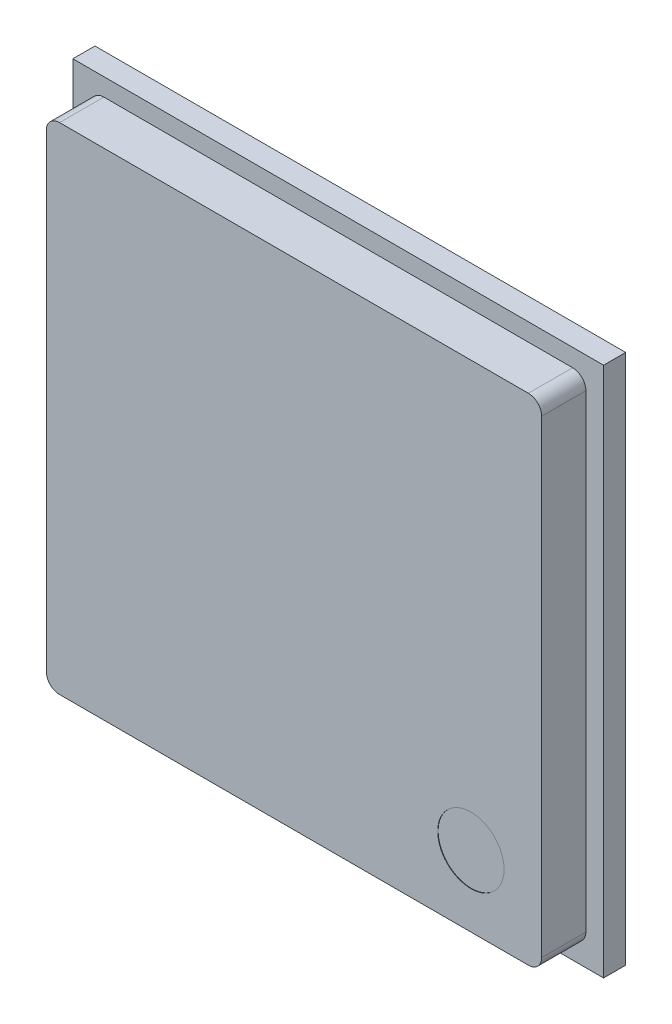
ISO-10303-21;
HEADER;
FILE_DESCRIPTION(('STEP AP214'),'2;1');
FILE_NAME('part.step','',(''),(''),'','','');
FILE_SCHEMA(('AUTOMOTIVE_DESIGN { 1 0 10303 214 1 1 1 1 }'));
ENDSEC;
DATA;
#1=APPLICATION_CONTEXT('core data for automotive mechanical design processes');
#2=APPLICATION_PROTOCOL_DEFINITION('international standard','automotive_design',2000,#1);
#3=PRODUCT_CONTEXT('',#1,'mechanical');
#4=PRODUCT('Part','Part','',(#3));
#5=PRODUCT_RELATED_PRODUCT_CATEGORY('part','',(#4));
#6=PRODUCT_DEFINITION_FORMATION('','',#4);
#7=PRODUCT_DEFINITION_CONTEXT('part definition',#1,'design');
#8=PRODUCT_DEFINITION('design','',#6,#7);
#9=PRODUCT_DEFINITION_SHAPE('','',#8);
#10=(LENGTH_UNIT() NAMED_UNIT(*) SI_UNIT(.MILLI.,.METRE.));
#11=(NAMED_UNIT(*) PLANE_ANGLE_UNIT() SI_UNIT($,.RADIAN.));
#12=(NAMED_UNIT(*) SI_UNIT($,.STERADIAN.) SOLID_ANGLE_UNIT());
#13=UNCERTAINTY_MEASURE_WITH_UNIT(LENGTH_MEASURE(1.E-05),#10,'distance_accuracy_value','');
#14=(GEOMETRIC_REPRESENTATION_CONTEXT(3) GLOBAL_UNCERTAINTY_ASSIGNED_CONTEXT((#13)) GLOBAL_UNIT_ASSIGNED_CONTEXT((#10,
#11,#12)) REPRESENTATION_CONTEXT('',''));
#15=CARTESIAN_POINT('',(0.,0.,0.));
#16=DIRECTION('',(0.,0.,1.));
#17=DIRECTION('',(1.,0.,0.));
#18=AXIS2_PLACEMENT_3D('',#15,#16,#17);
#19=CARTESIAN_POINT('',(0.,0.,0.5));
#20=DIRECTION('',(0.,0.,1.));
#21=DIRECTION('',(1.,0.,0.));
#22=AXIS2_PLACEMENT_3D('',#19,#20,#21);
#23=PLANE('',#22);
#24=DIRECTION('',(0.,-1.,0.));
#25=VECTOR('',#24,1.);
#26=CARTESIAN_POINT('',(0.,0.,0.5));
#27=LINE('',#26,#25);
#28=CARTESIAN_POINT('',(0.,0.,0.5));
#29=VERTEX_POINT('',#28);
#30=CARTESIAN_POINT('',(0.,-12.,0.5));
#31=VERTEX_POINT('',#30);
#32=EDGE_CURVE('E132',#29,#31,#27,.T.);
#33=ORIENTED_EDGE('',*,*,#32,.T.);
#34=DIRECTION('',(1.,0.,0.));
#35=VECTOR('',#34,1.);
#36=CARTESIAN_POINT('',(0.,-12.,0.5));
#37=LINE('',#36,#35);
#38=CARTESIAN_POINT('',(12.,-12.,0.5));
#39=VERTEX_POINT('',#38);
#40=EDGE_CURVE('E121',#31,#39,#37,.T.);
#41=ORIENTED_EDGE('',*,*,#40,.T.);
#42=DIRECTION('',(0.,1.,0.));
#43=VECTOR('',#42,1.);
#44=CARTESIAN_POINT('',(12.,0.,0.5));
#45=LINE('',#44,#43);
#46=CARTESIAN_POINT('',(12.,0.,0.5));
#47=VERTEX_POINT('',#46);
#48=EDGE_CURVE('E131',#39,#47,#45,.T.);
#49=ORIENTED_EDGE('',*,*,#48,.T.);
#50=DIRECTION('',(-1.,0.,0.));
#51=VECTOR('',#50,1.);
#52=CARTESIAN_POINT('',(0.,0.,0.5));
#53=LINE('',#52,#51);
#54=EDGE_CURVE('E136',#47,#29,#53,.T.);
#55=ORIENTED_EDGE('',*,*,#54,.T.);
#56=EDGE_LOOP('',(#33,#41,#49,#55));
#57=FACE_BOUND('',#56,.T.);
#58=DIRECTION('',(1.,0.,0.));
#59=VECTOR('',#58,1.);
#60=CARTESIAN_POINT('',(0.400000000000001,-11.6,0.5));
#61=LINE('',#60,#59);
#62=CARTESIAN_POINT('',(0.700000000000001,-11.6,0.5));
#63=VERTEX_POINT('',#62);
#64=CARTESIAN_POINT('',(11.3,-11.6,0.5));
#65=VERTEX_POINT('',#64);
#66=EDGE_CURVE('E193',#63,#65,#61,.T.);
#67=ORIENTED_EDGE('',*,*,#66,.F.);
#68=CARTESIAN_POINT('',(0.700000000000001,-11.3,0.5));
#69=DIRECTION('',(0.,0.,1.));
#70=DIRECTION('',(1.,0.,0.));
#71=AXIS2_PLACEMENT_3D('',#68,#69,#70);
#72=CIRCLE('',#71,0.3);
#73=CARTESIAN_POINT('',(0.400000000000001,-11.3,0.5));
#74=VERTEX_POINT('',#73);
#75=EDGE_CURVE('E11',#63,#74,#72,.F.);
#76=ORIENTED_EDGE('',*,*,#75,.T.);
#77=DIRECTION('',(0.,-1.,0.));
#78=VECTOR('',#77,1.);
#79=CARTESIAN_POINT('',(0.4,-0.4,0.5));
#80=LINE('',#79,#78);
#81=CARTESIAN_POINT('',(0.4,-0.7,0.5));
#82=VERTEX_POINT('',#81);
#83=EDGE_CURVE('E214',#82,#74,#80,.T.);
#84=ORIENTED_EDGE('',*,*,#83,.F.);
#85=CARTESIAN_POINT('',(0.7,-0.7,0.5));
#86=DIRECTION('',(0.,0.,1.));
#87=DIRECTION('',(1.,0.,0.));
#88=AXIS2_PLACEMENT_3D('',#85,#86,#87);
#89=CIRCLE('',#88,0.3);
#90=CARTESIAN_POINT('',(0.7,-0.4,0.5));
#91=VERTEX_POINT('',#90);
#92=EDGE_CURVE('E177',#82,#91,#89,.F.);
#93=ORIENTED_EDGE('',*,*,#92,.T.);
#94=DIRECTION('',(-1.,0.,0.));
#95=VECTOR('',#94,1.);
#96=CARTESIAN_POINT('',(0.4,-0.4,0.5));
#97=LINE('',#96,#95);
#98=CARTESIAN_POINT('',(11.3,-0.4,0.5));
#99=VERTEX_POINT('',#98);
#100=EDGE_CURVE('E184',#99,#91,#97,.T.);
#101=ORIENTED_EDGE('',*,*,#100,.F.);
#102=CARTESIAN_POINT('',(11.3,-0.7,0.5));
#103=DIRECTION('',(0.,0.,1.));
#104=DIRECTION('',(1.,0.,0.));
#105=AXIS2_PLACEMENT_3D('',#102,#103,#104);
#106=CIRCLE('',#105,0.3);
#107=CARTESIAN_POINT('',(11.6,-0.7,0.5));
#108=VERTEX_POINT('',#107);
#109=EDGE_CURVE('E179',#99,#108,#106,.F.);
#110=ORIENTED_EDGE('',*,*,#109,.T.);
#111=DIRECTION('',(0.,1.,0.));
#112=VECTOR('',#111,1.);
#113=CARTESIAN_POINT('',(11.6,-0.4,0.5));
#114=LINE('',#113,#112);
#115=CARTESIAN_POINT('',(11.6,-11.3,0.5));
#116=VERTEX_POINT('',#115);
#117=EDGE_CURVE('E182',#116,#108,#114,.T.);
#118=ORIENTED_EDGE('',*,*,#117,.F.);
#119=CARTESIAN_POINT('',(11.3,-11.3,0.5));
#120=DIRECTION('',(0.,0.,1.));
#121=DIRECTION('',(1.,0.,0.));
#122=AXIS2_PLACEMENT_3D('',#119,#120,#121);
#123=CIRCLE('',#122,0.3);
#124=EDGE_CURVE('E41',#116,#65,#123,.F.);
#125=ORIENTED_EDGE('',*,*,#124,.T.);
#126=EDGE_LOOP('',(#67,#76,#84,#93,#101,#110,#118,#125));
#127=FACE_BOUND('',#126,.T.);
#128=ADVANCED_FACE('F33',(#57,#127),#23,.T.);
#129=CARTESIAN_POINT('',(0.,0.,0.5));
#130=DIRECTION('',(1.,0.,0.));
#131=DIRECTION('',(0.,1.,0.));
#132=AXIS2_PLACEMENT_3D('',#129,#130,#131);
#133=PLANE('',#132);
#134=DIRECTION('',(0.,-1.,0.));
#135=VECTOR('',#134,1.);
#136=CARTESIAN_POINT('',(0.,0.,0.));
#137=LINE('',#136,#135);
#138=CARTESIAN_POINT('',(0.,0.,0.));
#139=VERTEX_POINT('',#138);
#140=CARTESIAN_POINT('',(0.,-12.,0.));
#141=VERTEX_POINT('',#140);
#142=EDGE_CURVE('E144',#139,#141,#137,.T.);
#143=ORIENTED_EDGE('',*,*,#142,.T.);
#144=DIRECTION('',(0.,0.,-1.));
#145=VECTOR('',#144,1.);
#146=CARTESIAN_POINT('',(0.,-12.,0.5));
#147=LINE('',#146,#145);
#148=EDGE_CURVE('E125',#31,#141,#147,.T.);
#149=ORIENTED_EDGE('',*,*,#148,.F.);
#150=ORIENTED_EDGE('',*,*,#32,.F.);
#151=DIRECTION('',(0.,0.,-1.));
#152=VECTOR('',#151,1.);
#153=CARTESIAN_POINT('',(0.,0.,0.5));
#154=LINE('',#153,#152);
#155=EDGE_CURVE('E222',#29,#139,#154,.T.);
#156=ORIENTED_EDGE('',*,*,#155,.T.);
#157=EDGE_LOOP('',(#143,#149,#150,#156));
#158=FACE_BOUND('',#157,.T.);
#159=ADVANCED_FACE('F142',(#158),#133,.F.);
#160=CARTESIAN_POINT('',(0.,-12.,0.5));
#161=DIRECTION('',(0.,1.,0.));
#162=DIRECTION('',(0.,0.,1.));
#163=AXIS2_PLACEMENT_3D('',#160,#161,#162);
#164=PLANE('',#163);
#165=DIRECTION('',(1.,0.,0.));
#166=VECTOR('',#165,1.);
#167=CARTESIAN_POINT('',(0.,-12.,0.));
#168=LINE('',#167,#166);
#169=CARTESIAN_POINT('',(12.,-12.,0.));
#170=VERTEX_POINT('',#169);
#171=EDGE_CURVE('E208',#141,#170,#168,.T.);
#172=ORIENTED_EDGE('',*,*,#171,.T.);
#173=DIRECTION('',(0.,0.,-1.));
#174=VECTOR('',#173,1.);
#175=CARTESIAN_POINT('',(12.,-12.,0.5));
#176=LINE('',#175,#174);
#177=EDGE_CURVE('E128',#39,#170,#176,.T.);
#178=ORIENTED_EDGE('',*,*,#177,.F.);
#179=ORIENTED_EDGE('',*,*,#40,.F.);
#180=ORIENTED_EDGE('',*,*,#148,.T.);
#181=EDGE_LOOP('',(#172,#178,#179,#180));
#182=FACE_BOUND('',#181,.T.);
#183=ADVANCED_FACE('F123',(#182),#164,.F.);
#184=CARTESIAN_POINT('',(12.,0.,0.5));
#185=DIRECTION('',(-1.,0.,0.));
#186=DIRECTION('',(0.,-1.,0.));
#187=AXIS2_PLACEMENT_3D('',#184,#185,#186);
#188=PLANE('',#187);
#189=DIRECTION('',(0.,1.,0.));
#190=VECTOR('',#189,1.);
#191=CARTESIAN_POINT('',(12.,0.,0.));
#192=LINE('',#191,#190);
#193=CARTESIAN_POINT('',(12.,0.,0.));
#194=VERTEX_POINT('',#193);
#195=EDGE_CURVE('E225',#170,#194,#192,.T.);
#196=ORIENTED_EDGE('',*,*,#195,.T.);
#197=DIRECTION('',(0.,0.,-1.));
#198=VECTOR('',#197,1.);
#199=CARTESIAN_POINT('',(12.,0.,0.5));
#200=LINE('',#199,#198);
#201=EDGE_CURVE('E149',#47,#194,#200,.T.);
#202=ORIENTED_EDGE('',*,*,#201,.F.);
#203=ORIENTED_EDGE('',*,*,#48,.F.);
#204=ORIENTED_EDGE('',*,*,#177,.T.);
#205=EDGE_LOOP('',(#196,#202,#203,#204));
#206=FACE_BOUND('',#205,.T.);
#207=ADVANCED_FACE('F237',(#206),#188,.F.);
#208=CARTESIAN_POINT('',(0.,0.,0.5));
#209=DIRECTION('',(0.,-1.,0.));
#210=DIRECTION('',(0.,0.,-1.));
#211=AXIS2_PLACEMENT_3D('',#208,#209,#210);
#212=PLANE('',#211);
#213=DIRECTION('',(-1.,0.,0.));
#214=VECTOR('',#213,1.);
#215=CARTESIAN_POINT('',(0.,0.,0.));
#216=LINE('',#215,#214);
#217=EDGE_CURVE('E140',#194,#139,#216,.T.);
#218=ORIENTED_EDGE('',*,*,#217,.T.);
#219=ORIENTED_EDGE('',*,*,#155,.F.);
#220=ORIENTED_EDGE('',*,*,#54,.F.);
#221=ORIENTED_EDGE('',*,*,#201,.T.);
#222=EDGE_LOOP('',(#218,#219,#220,#221));
#223=FACE_BOUND('',#222,.T.);
#224=ADVANCED_FACE('F232',(#223),#212,.F.);
#225=CARTESIAN_POINT('',(0.,0.,0.));
#226=DIRECTION('',(0.,0.,1.));
#227=DIRECTION('',(1.,0.,0.));
#228=AXIS2_PLACEMENT_3D('',#225,#226,#227);
#229=PLANE('',#228);
#230=ORIENTED_EDGE('',*,*,#142,.F.);
#231=ORIENTED_EDGE('',*,*,#217,.F.);
#232=ORIENTED_EDGE('',*,*,#195,.F.);
#233=ORIENTED_EDGE('',*,*,#171,.F.);
#234=EDGE_LOOP('',(#230,#231,#232,#233));
#235=FACE_BOUND('',#234,.T.);
#236=ADVANCED_FACE('F236',(#235),#229,.F.);
#237=CARTESIAN_POINT('',(0.4,-0.4,1.5));
#238=DIRECTION('',(1.,0.,0.));
#239=DIRECTION('',(0.,1.,0.));
#240=AXIS2_PLACEMENT_3D('',#237,#238,#239);
#241=PLANE('',#240);
#242=DIRECTION('',(0.,-1.,0.));
#243=VECTOR('',#242,1.);
#244=CARTESIAN_POINT('',(0.4,-0.4,1.5));
#245=LINE('',#244,#243);
#246=CARTESIAN_POINT('',(0.4,-0.7,1.5));
#247=VERTEX_POINT('',#246);
#248=CARTESIAN_POINT('',(0.400000000000001,-11.3,1.5));
#249=VERTEX_POINT('',#248);
#250=EDGE_CURVE('E219',#247,#249,#245,.T.);
#251=ORIENTED_EDGE('',*,*,#250,.F.);
#252=DIRECTION('',(0.,0.,-1.));
#253=VECTOR('',#252,1.);
#254=CARTESIAN_POINT('',(0.4,-0.7,1.5));
#255=LINE('',#254,#253);
#256=EDGE_CURVE('E147',#247,#82,#255,.T.);
#257=ORIENTED_EDGE('',*,*,#256,.T.);
#258=ORIENTED_EDGE('',*,*,#83,.T.);
#259=DIRECTION('',(0.,0.,-1.));
#260=VECTOR('',#259,1.);
#261=CARTESIAN_POINT('',(0.400000000000001,-11.3,1.5));
#262=LINE('',#261,#260);
#263=EDGE_CURVE('E145',#74,#249,#262,.F.);
#264=ORIENTED_EDGE('',*,*,#263,.T.);
#265=EDGE_LOOP('',(#251,#257,#258,#264));
#266=FACE_BOUND('',#265,.T.);
#267=ADVANCED_FACE('F254',(#266),#241,.F.);
#268=CARTESIAN_POINT('',(0.400000000000001,-11.6,1.5));
#269=DIRECTION('',(0.,1.,0.));
#270=DIRECTION('',(0.,0.,1.));
#271=AXIS2_PLACEMENT_3D('',#268,#269,#270);
#272=PLANE('',#271);
#273=ORIENTED_EDGE('',*,*,#66,.T.);
#274=DIRECTION('',(0.,0.,-1.));
#275=VECTOR('',#274,1.);
#276=CARTESIAN_POINT('',(11.3,-11.6,1.5));
#277=LINE('',#276,#275);
#278=CARTESIAN_POINT('',(11.3,-11.6,1.5));
#279=VERTEX_POINT('',#278);
#280=EDGE_CURVE('E175',#65,#279,#277,.F.);
#281=ORIENTED_EDGE('',*,*,#280,.T.);
#282=DIRECTION('',(1.,0.,0.));
#283=VECTOR('',#282,1.);
#284=CARTESIAN_POINT('',(0.400000000000001,-11.6,1.5));
#285=LINE('',#284,#283);
#286=CARTESIAN_POINT('',(0.700000000000001,-11.6,1.5));
#287=VERTEX_POINT('',#286);
#288=EDGE_CURVE('E210',#287,#279,#285,.T.);
#289=ORIENTED_EDGE('',*,*,#288,.F.);
#290=DIRECTION('',(0.,0.,-1.));
#291=VECTOR('',#290,1.);
#292=CARTESIAN_POINT('',(0.700000000000001,-11.6,1.5));
#293=LINE('',#292,#291);
#294=EDGE_CURVE('E173',#287,#63,#293,.T.);
#295=ORIENTED_EDGE('',*,*,#294,.T.);
#296=EDGE_LOOP('',(#273,#281,#289,#295));
#297=FACE_BOUND('',#296,.T.);
#298=ADVANCED_FACE('F260',(#297),#272,.F.);
#299=CARTESIAN_POINT('',(11.6,-0.4,1.5));
#300=DIRECTION('',(-1.,0.,0.));
#301=DIRECTION('',(0.,-1.,0.));
#302=AXIS2_PLACEMENT_3D('',#299,#300,#301);
#303=PLANE('',#302);
#304=ORIENTED_EDGE('',*,*,#117,.T.);
#305=DIRECTION('',(0.,0.,-1.));
#306=VECTOR('',#305,1.);
#307=CARTESIAN_POINT('',(11.6,-0.7,1.5));
#308=LINE('',#307,#306);
#309=CARTESIAN_POINT('',(11.6,-0.7,1.5));
#310=VERTEX_POINT('',#309);
#311=EDGE_CURVE('E171',#108,#310,#308,.F.);
#312=ORIENTED_EDGE('',*,*,#311,.T.);
#313=DIRECTION('',(0.,1.,0.));
#314=VECTOR('',#313,1.);
#315=CARTESIAN_POINT('',(11.6,-0.4,1.5));
#316=LINE('',#315,#314);
#317=CARTESIAN_POINT('',(11.6,-11.3,1.5));
#318=VERTEX_POINT('',#317);
#319=EDGE_CURVE('E203',#318,#310,#316,.T.);
#320=ORIENTED_EDGE('',*,*,#319,.F.);
#321=DIRECTION('',(0.,0.,-1.));
#322=VECTOR('',#321,1.);
#323=CARTESIAN_POINT('',(11.6,-11.3,1.5));
#324=LINE('',#323,#322);
#325=EDGE_CURVE('E168',#318,#116,#324,.T.);
#326=ORIENTED_EDGE('',*,*,#325,.T.);
#327=EDGE_LOOP('',(#304,#312,#320,#326));
#328=FACE_BOUND('',#327,.T.);
#329=ADVANCED_FACE('F189',(#328),#303,.F.);
#330=CARTESIAN_POINT('',(0.4,-0.4,1.5));
#331=DIRECTION('',(0.,-1.,0.));
#332=DIRECTION('',(0.,0.,-1.));
#333=AXIS2_PLACEMENT_3D('',#330,#331,#332);
#334=PLANE('',#333);
#335=ORIENTED_EDGE('',*,*,#100,.T.);
#336=DIRECTION('',(0.,0.,-1.));
#337=VECTOR('',#336,1.);
#338=CARTESIAN_POINT('',(0.7,-0.4,1.5));
#339=LINE('',#338,#337);
#340=CARTESIAN_POINT('',(0.7,-0.4,1.5));
#341=VERTEX_POINT('',#340);
#342=EDGE_CURVE('E158',#91,#341,#339,.F.);
#343=ORIENTED_EDGE('',*,*,#342,.T.);
#344=DIRECTION('',(-1.,0.,0.));
#345=VECTOR('',#344,1.);
#346=CARTESIAN_POINT('',(0.4,-0.4,1.5));
#347=LINE('',#346,#345);
#348=CARTESIAN_POINT('',(11.3,-0.4,1.5));
#349=VERTEX_POINT('',#348);
#350=EDGE_CURVE('E201',#349,#341,#347,.T.);
#351=ORIENTED_EDGE('',*,*,#350,.F.);
#352=DIRECTION('',(0.,0.,-1.));
#353=VECTOR('',#352,1.);
#354=CARTESIAN_POINT('',(11.3,-0.4,1.5));
#355=LINE('',#354,#353);
#356=EDGE_CURVE('E155',#349,#99,#355,.T.);
#357=ORIENTED_EDGE('',*,*,#356,.T.);
#358=EDGE_LOOP('',(#335,#343,#351,#357));
#359=FACE_BOUND('',#358,.T.);
#360=ADVANCED_FACE('F205',(#359),#334,.F.);
#361=CARTESIAN_POINT('',(0.,0.,1.5));
#362=DIRECTION('',(0.,0.,1.));
#363=DIRECTION('',(1.,0.,0.));
#364=AXIS2_PLACEMENT_3D('',#361,#362,#363);
#365=PLANE('',#364);
#366=CARTESIAN_POINT('',(10.,-10.,1.5));
#367=DIRECTION('',(0.,0.,1.));
#368=DIRECTION('',(1.,0.,0.));
#369=AXIS2_PLACEMENT_3D('',#366,#367,#368);
#370=CIRCLE('',#369,0.75);
#371=CARTESIAN_POINT('',(10.75,-10.,1.5));
#372=VERTEX_POINT('',#371);
#373=EDGE_CURVE('E279',#372,#372,#370,.T.);
#374=ORIENTED_EDGE('',*,*,#373,.F.);
#375=EDGE_LOOP('',(#374));
#376=FACE_BOUND('',#375,.T.);
#377=ORIENTED_EDGE('',*,*,#350,.T.);
#378=CARTESIAN_POINT('',(0.7,-0.7,1.5));
#379=DIRECTION('',(0.,0.,1.));
#380=DIRECTION('',(1.,0.,0.));
#381=AXIS2_PLACEMENT_3D('',#378,#379,#380);
#382=CIRCLE('',#381,0.3);
#383=EDGE_CURVE('E166',#341,#247,#382,.T.);
#384=ORIENTED_EDGE('',*,*,#383,.T.);
#385=ORIENTED_EDGE('',*,*,#250,.T.);
#386=CARTESIAN_POINT('',(0.700000000000001,-11.3,1.5));
#387=DIRECTION('',(0.,0.,1.));
#388=DIRECTION('',(1.,0.,0.));
#389=AXIS2_PLACEMENT_3D('',#386,#387,#388);
#390=CIRCLE('',#389,0.3);
#391=EDGE_CURVE('E160',#249,#287,#390,.T.);
#392=ORIENTED_EDGE('',*,*,#391,.T.);
#393=ORIENTED_EDGE('',*,*,#288,.T.);
#394=CARTESIAN_POINT('',(11.3,-11.3,1.5));
#395=DIRECTION('',(0.,0.,1.));
#396=DIRECTION('',(1.,0.,0.));
#397=AXIS2_PLACEMENT_3D('',#394,#395,#396);
#398=CIRCLE('',#397,0.3);
#399=EDGE_CURVE('E162',#279,#318,#398,.T.);
#400=ORIENTED_EDGE('',*,*,#399,.T.);
#401=ORIENTED_EDGE('',*,*,#319,.T.);
#402=CARTESIAN_POINT('',(11.3,-0.7,1.5));
#403=DIRECTION('',(0.,0.,1.));
#404=DIRECTION('',(1.,0.,0.));
#405=AXIS2_PLACEMENT_3D('',#402,#403,#404);
#406=CIRCLE('',#405,0.3);
#407=EDGE_CURVE('E164',#310,#349,#406,.T.);
#408=ORIENTED_EDGE('',*,*,#407,.T.);
#409=EDGE_LOOP('',(#377,#384,#385,#392,#393,#400,#401,#408));
#410=FACE_BOUND('',#409,.T.);
#411=ADVANCED_FACE('F200',(#376,#410),#365,.T.);
#412=CARTESIAN_POINT('',(0.7,-0.7,1.5));
#413=DIRECTION('',(0.,0.,-1.));
#414=DIRECTION('',(-1.,0.,0.));
#415=AXIS2_PLACEMENT_3D('',#412,#413,#414);
#416=CYLINDRICAL_SURFACE('',#415,0.3);
#417=ORIENTED_EDGE('',*,*,#383,.F.);
#418=ORIENTED_EDGE('',*,*,#342,.F.);
#419=ORIENTED_EDGE('',*,*,#92,.F.);
#420=ORIENTED_EDGE('',*,*,#256,.F.);
#421=EDGE_LOOP('',(#417,#418,#419,#420));
#422=FACE_BOUND('',#421,.T.);
#423=ADVANCED_FACE('F273',(#422),#416,.T.);
#424=CARTESIAN_POINT('',(11.3,-0.7,1.5));
#425=DIRECTION('',(0.,0.,-1.));
#426=DIRECTION('',(-1.,0.,0.));
#427=AXIS2_PLACEMENT_3D('',#424,#425,#426);
#428=CYLINDRICAL_SURFACE('',#427,0.3);
#429=ORIENTED_EDGE('',*,*,#407,.F.);
#430=ORIENTED_EDGE('',*,*,#311,.F.);
#431=ORIENTED_EDGE('',*,*,#109,.F.);
#432=ORIENTED_EDGE('',*,*,#356,.F.);
#433=EDGE_LOOP('',(#429,#430,#431,#432));
#434=FACE_BOUND('',#433,.T.);
#435=ADVANCED_FACE('F196',(#434),#428,.T.);
#436=CARTESIAN_POINT('',(11.3,-11.3,1.5));
#437=DIRECTION('',(0.,0.,-1.));
#438=DIRECTION('',(-1.,0.,0.));
#439=AXIS2_PLACEMENT_3D('',#436,#437,#438);
#440=CYLINDRICAL_SURFACE('',#439,0.3);
#441=ORIENTED_EDGE('',*,*,#399,.F.);
#442=ORIENTED_EDGE('',*,*,#280,.F.);
#443=ORIENTED_EDGE('',*,*,#124,.F.);
#444=ORIENTED_EDGE('',*,*,#325,.F.);
#445=EDGE_LOOP('',(#441,#442,#443,#444));
#446=FACE_BOUND('',#445,.T.);
#447=ADVANCED_FACE('F328',(#446),#440,.T.);
#448=CARTESIAN_POINT('',(0.700000000000001,-11.3,1.5));
#449=DIRECTION('',(0.,0.,-1.));
#450=DIRECTION('',(-1.,0.,0.));
#451=AXIS2_PLACEMENT_3D('',#448,#449,#450);
#452=CYLINDRICAL_SURFACE('',#451,0.3);
#453=ORIENTED_EDGE('',*,*,#391,.F.);
#454=ORIENTED_EDGE('',*,*,#263,.F.);
#455=ORIENTED_EDGE('',*,*,#75,.F.);
#456=ORIENTED_EDGE('',*,*,#294,.F.);
#457=EDGE_LOOP('',(#453,#454,#455,#456));
#458=FACE_BOUND('',#457,.T.);
#459=ADVANCED_FACE('F35',(#458),#452,.T.);
#460=CARTESIAN_POINT('',(10.,-10.,1.49));
#461=DIRECTION('',(0.,0.,1.));
#462=DIRECTION('',(1.,0.,0.));
#463=AXIS2_PLACEMENT_3D('',#460,#461,#462);
#464=CYLINDRICAL_SURFACE('',#463,0.75);
#465=CARTESIAN_POINT('',(10.,-10.,1.49));
#466=DIRECTION('',(0.,0.,1.));
#467=DIRECTION('',(1.,0.,0.));
#468=AXIS2_PLACEMENT_3D('',#465,#466,#467);
#469=CIRCLE('',#468,0.75);
#470=CARTESIAN_POINT('',(10.75,-10.,1.49));
#471=VERTEX_POINT('',#470);
#472=EDGE_CURVE('E217',#471,#471,#469,.T.);
#473=CARTESIAN_POINT('',(10.75,-10.,1.49));
#474=CARTESIAN_POINT('',(10.75,-10.,1.49010416666667));
#475=CARTESIAN_POINT('',(10.75,-10.,1.49020833333333));
#476=CARTESIAN_POINT('',(10.75,-10.,1.49041666666667));
#477=CARTESIAN_POINT('',(10.75,-10.,1.49052083333333));
#478=CARTESIAN_POINT('',(10.75,-10.,1.49072916666667));
#479=CARTESIAN_POINT('',(10.75,-10.,1.49083333333333));
#480=CARTESIAN_POINT('',(10.75,-10.,1.49104166666667));
#481=CARTESIAN_POINT('',(10.75,-10.,1.49114583333333));
#482=CARTESIAN_POINT('',(10.75,-10.,1.49135416666667));
#483=CARTESIAN_POINT('',(10.75,-10.,1.49145833333333));
#484=CARTESIAN_POINT('',(10.75,-10.,1.49166666666667));
#485=CARTESIAN_POINT('',(10.75,-10.,1.49177083333333));
#486=CARTESIAN_POINT('',(10.75,-10.,1.49197916666667));
#487=CARTESIAN_POINT('',(10.75,-10.,1.49208333333333));
#488=CARTESIAN_POINT('',(10.75,-10.,1.49229166666667));
#489=CARTESIAN_POINT('',(10.75,-10.,1.49239583333333));
#490=CARTESIAN_POINT('',(10.75,-10.,1.49260416666667));
#491=CARTESIAN_POINT('',(10.75,-10.,1.49270833333333));
#492=CARTESIAN_POINT('',(10.75,-10.,1.49291666666667));
#493=CARTESIAN_POINT('',(10.75,-10.,1.49302083333333));
#494=CARTESIAN_POINT('',(10.75,-10.,1.49322916666667));
#495=CARTESIAN_POINT('',(10.75,-10.,1.49333333333333));
#496=CARTESIAN_POINT('',(10.75,-10.,1.49354166666667));
#497=CARTESIAN_POINT('',(10.75,-10.,1.49364583333333));
#498=CARTESIAN_POINT('',(10.75,-10.,1.49385416666667));
#499=CARTESIAN_POINT('',(10.75,-10.,1.49395833333333));
#500=CARTESIAN_POINT('',(10.75,-10.,1.49416666666667));
#501=CARTESIAN_POINT('',(10.75,-10.,1.49427083333333));
#502=CARTESIAN_POINT('',(10.75,-10.,1.49447916666667));
#503=CARTESIAN_POINT('',(10.75,-10.,1.49458333333333));
#504=CARTESIAN_POINT('',(10.75,-10.,1.49479166666667));
#505=CARTESIAN_POINT('',(10.75,-10.,1.49489583333333));
#506=CARTESIAN_POINT('',(10.75,-10.,1.49510416666667));
#507=CARTESIAN_POINT('',(10.75,-10.,1.49520833333333));
#508=CARTESIAN_POINT('',(10.75,-10.,1.49541666666667));
#509=CARTESIAN_POINT('',(10.75,-10.,1.49552083333333));
#510=CARTESIAN_POINT('',(10.75,-10.,1.49572916666667));
#511=CARTESIAN_POINT('',(10.75,-10.,1.49583333333333));
#512=CARTESIAN_POINT('',(10.75,-10.,1.49604166666667));
#513=CARTESIAN_POINT('',(10.75,-10.,1.49614583333333));
#514=CARTESIAN_POINT('',(10.75,-10.,1.49635416666667));
#515=CARTESIAN_POINT('',(10.75,-10.,1.49645833333333));
#516=CARTESIAN_POINT('',(10.75,-10.,1.49666666666667));
#517=CARTESIAN_POINT('',(10.75,-10.,1.49677083333333));
#518=CARTESIAN_POINT('',(10.75,-10.,1.49697916666667));
#519=CARTESIAN_POINT('',(10.75,-10.,1.49708333333333));
#520=CARTESIAN_POINT('',(10.75,-10.,1.49729166666667));
#521=CARTESIAN_POINT('',(10.75,-10.,1.49739583333333));
#522=CARTESIAN_POINT('',(10.75,-10.,1.49760416666667));
#523=CARTESIAN_POINT('',(10.75,-10.,1.49770833333333));
#524=CARTESIAN_POINT('',(10.75,-10.,1.49791666666667));
#525=CARTESIAN_POINT('',(10.75,-10.,1.49802083333333));
#526=CARTESIAN_POINT('',(10.75,-10.,1.49822916666667));
#527=CARTESIAN_POINT('',(10.75,-10.,1.49833333333333));
#528=CARTESIAN_POINT('',(10.75,-10.,1.49854166666667));
#529=CARTESIAN_POINT('',(10.75,-10.,1.49864583333333));
#530=CARTESIAN_POINT('',(10.75,-10.,1.49885416666667));
#531=CARTESIAN_POINT('',(10.75,-10.,1.49895833333333));
#532=CARTESIAN_POINT('',(10.75,-10.,1.49916666666667));
#533=CARTESIAN_POINT('',(10.75,-10.,1.49927083333333));
#534=CARTESIAN_POINT('',(10.75,-10.,1.49947916666667));
#535=CARTESIAN_POINT('',(10.75,-10.,1.49958333333333));
#536=CARTESIAN_POINT('',(10.75,-10.,1.49979166666667));
#537=CARTESIAN_POINT('',(10.75,-10.,1.49989583333333));
#538=CARTESIAN_POINT('',(10.75,-10.,1.5));
#539=B_SPLINE_CURVE_WITH_KNOTS('',3,(#473,#474,#475,#476,#477,#478,#479,#480,#481,#482,#483,
#484,#485,#486,#487,#488,#489,#490,#491,#492,#493,#494,#495,#496,#497,#498,#499,#500,#501,#502,
#503,#504,#505,#506,#507,#508,#509,#510,#511,#512,#513,#514,#515,#516,#517,#518,#519,#520,#521,
#522,#523,#524,#525,#526,#527,#528,#529,#530,#531,#532,#533,#534,#535,#536,#537,#538),
.UNSPECIFIED.,.F.,.F.,(4,2,2,2,2,2,2,2,2,2,2,2,2,2,2,2,2,2,2,2,2,2,2,2,2,2,2,2,2,2,2,2,4),(0.,
0.000312499999999879,0.000624999999999975,0.000937499999999853,0.00124999999999995,
0.00156249999999983,0.00187499999999992,0.0021874999999998,0.0024999999999999,
0.00281249999999999,0.00312499999999987,0.00343749999999997,0.00374999999999985,
0.00406249999999994,0.00437499999999982,0.00468749999999992,0.0049999999999998,
0.00531249999999989,0.00562499999999999,0.00593749999999987,0.00624999999999996,
0.00656249999999984,0.00687499999999994,0.00718749999999982,0.00749999999999991,
0.00781250000000001,0.00812499999999989,0.00843749999999998,0.00874999999999986,
0.00906249999999996,0.00937499999999983,0.00968749999999993,0.00999999999999981),.UNSPECIFIED.);
#540=EDGE_CURVE('BSEAM287',#471,#372,#539,.T.);
#541=ORIENTED_EDGE('',*,*,#472,.F.);
#542=ORIENTED_EDGE('',*,*,#373,.T.);
#543=ORIENTED_EDGE('',*,*,#540,.T.);
#544=ORIENTED_EDGE('',*,*,#540,.F.);
#545=EDGE_LOOP('',(#541,#543,#542,#544));
#546=FACE_BOUND('',#545,.T.);
#547=ADVANCED_FACE('F287',(#546),#464,.F.);
#548=CARTESIAN_POINT('',(10.,-10.,1.49));
#549=DIRECTION('',(0.,0.,1.));
#550=DIRECTION('',(1.,0.,0.));
#551=AXIS2_PLACEMENT_3D('',#548,#549,#550);
#552=PLANE('',#551);
#553=ORIENTED_EDGE('',*,*,#472,.T.);
#554=EDGE_LOOP('',(#553));
#555=FACE_BOUND('',#554,.T.);
#556=ADVANCED_FACE('F285',(#555),#552,.T.);
#557=CLOSED_SHELL('',(#128,#159,#183,#207,#224,#236,#267,#298,#329,#360,#411,#423,#435,#447,
#459,#547,#556));
#558=MANIFOLD_SOLID_BREP('B2',#557);
#559=ADVANCED_BREP_SHAPE_REPRESENTATION('',(#18,#558),#14);
#560=SHAPE_DEFINITION_REPRESENTATION(#9,#559);
ENDSEC;
END-ISO-10303-21;
